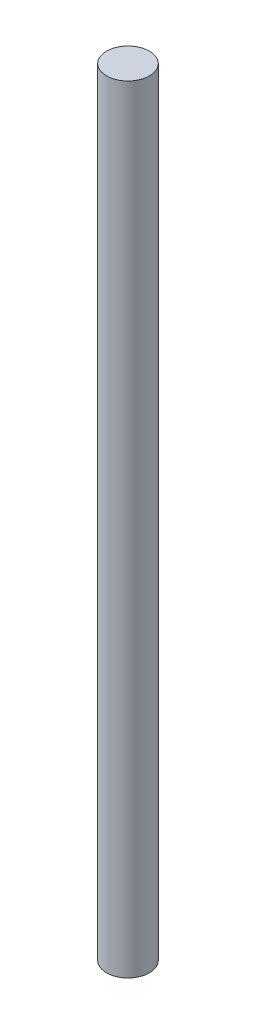
ISO-10303-21;
HEADER;
FILE_DESCRIPTION(('STEP AP214'),'2;1');
FILE_NAME('part.step','',(''),(''),'','','');
FILE_SCHEMA(('AUTOMOTIVE_DESIGN { 1 0 10303 214 1 1 1 1 }'));
ENDSEC;
DATA;
#1=APPLICATION_CONTEXT('core data for automotive mechanical design processes');
#2=APPLICATION_PROTOCOL_DEFINITION('international standard','automotive_design',2000,#1);
#3=PRODUCT_CONTEXT('',#1,'mechanical');
#4=PRODUCT('Part','Part','',(#3));
#5=PRODUCT_RELATED_PRODUCT_CATEGORY('part','',(#4));
#6=PRODUCT_DEFINITION_FORMATION('','',#4);
#7=PRODUCT_DEFINITION_CONTEXT('part definition',#1,'design');
#8=PRODUCT_DEFINITION('design','',#6,#7);
#9=PRODUCT_DEFINITION_SHAPE('','',#8);
#10=(LENGTH_UNIT() NAMED_UNIT(*) SI_UNIT(.MILLI.,.METRE.));
#11=(NAMED_UNIT(*) PLANE_ANGLE_UNIT() SI_UNIT($,.RADIAN.));
#12=(NAMED_UNIT(*) SI_UNIT($,.STERADIAN.) SOLID_ANGLE_UNIT());
#13=UNCERTAINTY_MEASURE_WITH_UNIT(LENGTH_MEASURE(1.E-05),#10,'distance_accuracy_value','');
#14=(GEOMETRIC_REPRESENTATION_CONTEXT(3) GLOBAL_UNCERTAINTY_ASSIGNED_CONTEXT((#13)) GLOBAL_UNIT_ASSIGNED_CONTEXT((#10,
#11,#12)) REPRESENTATION_CONTEXT('',''));
#15=CARTESIAN_POINT('',(0.,0.,0.));
#16=DIRECTION('',(0.,0.,1.));
#17=DIRECTION('',(1.,0.,0.));
#18=AXIS2_PLACEMENT_3D('',#15,#16,#17);
#19=CARTESIAN_POINT('',(0.,63.5,0.));
#20=DIRECTION('',(0.,-1.,0.));
#21=DIRECTION('',(0.,0.,-1.));
#22=AXIS2_PLACEMENT_3D('',#19,#20,#21);
#23=CYLINDRICAL_SURFACE('',#22,1.7526);
#24=CARTESIAN_POINT('',(0.,63.5,0.));
#25=DIRECTION('',(0.,1.,0.));
#26=DIRECTION('',(0.,0.,1.));
#27=AXIS2_PLACEMENT_3D('',#24,#25,#26);
#28=CIRCLE('',#27,1.7526);
#29=CARTESIAN_POINT('',(0.,63.5,1.7526));
#30=VERTEX_POINT('',#29);
#31=EDGE_CURVE('E10',#30,#30,#28,.T.);
#32=ORIENTED_EDGE('',*,*,#31,.F.);
#33=EDGE_LOOP('',(#32));
#34=FACE_BOUND('',#33,.T.);
#35=CARTESIAN_POINT('',(0.,0.,0.));
#36=DIRECTION('',(0.,1.,0.));
#37=DIRECTION('',(0.,0.,1.));
#38=AXIS2_PLACEMENT_3D('',#35,#36,#37);
#39=CIRCLE('',#38,1.7526);
#40=CARTESIAN_POINT('',(0.,0.,1.7526));
#41=VERTEX_POINT('',#40);
#42=EDGE_CURVE('E35',#41,#41,#39,.T.);
#43=ORIENTED_EDGE('',*,*,#42,.T.);
#44=EDGE_LOOP('',(#43));
#45=FACE_BOUND('',#44,.T.);
#46=ADVANCED_FACE('F32',(#34,#45),#23,.T.);
#47=CARTESIAN_POINT('',(0.,63.5,0.));
#48=DIRECTION('',(0.,1.,0.));
#49=DIRECTION('',(0.,0.,1.));
#50=AXIS2_PLACEMENT_3D('',#47,#48,#49);
#51=PLANE('',#50);
#52=ORIENTED_EDGE('',*,*,#31,.T.);
#53=EDGE_LOOP('',(#52));
#54=FACE_BOUND('',#53,.T.);
#55=ADVANCED_FACE('F47',(#54),#51,.T.);
#56=CARTESIAN_POINT('',(0.,0.,0.));
#57=DIRECTION('',(0.,1.,0.));
#58=DIRECTION('',(0.,0.,1.));
#59=AXIS2_PLACEMENT_3D('',#56,#57,#58);
#60=PLANE('',#59);
#61=ORIENTED_EDGE('',*,*,#42,.F.);
#62=EDGE_LOOP('',(#61));
#63=FACE_BOUND('',#62,.T.);
#64=ADVANCED_FACE('F45',(#63),#60,.F.);
#65=CLOSED_SHELL('',(#46,#55,#64));
#66=MANIFOLD_SOLID_BREP('B2',#65);
#67=ADVANCED_BREP_SHAPE_REPRESENTATION('',(#18,#66),#14);
#68=SHAPE_DEFINITION_REPRESENTATION(#9,#67);
ENDSEC;
END-ISO-10303-21;
